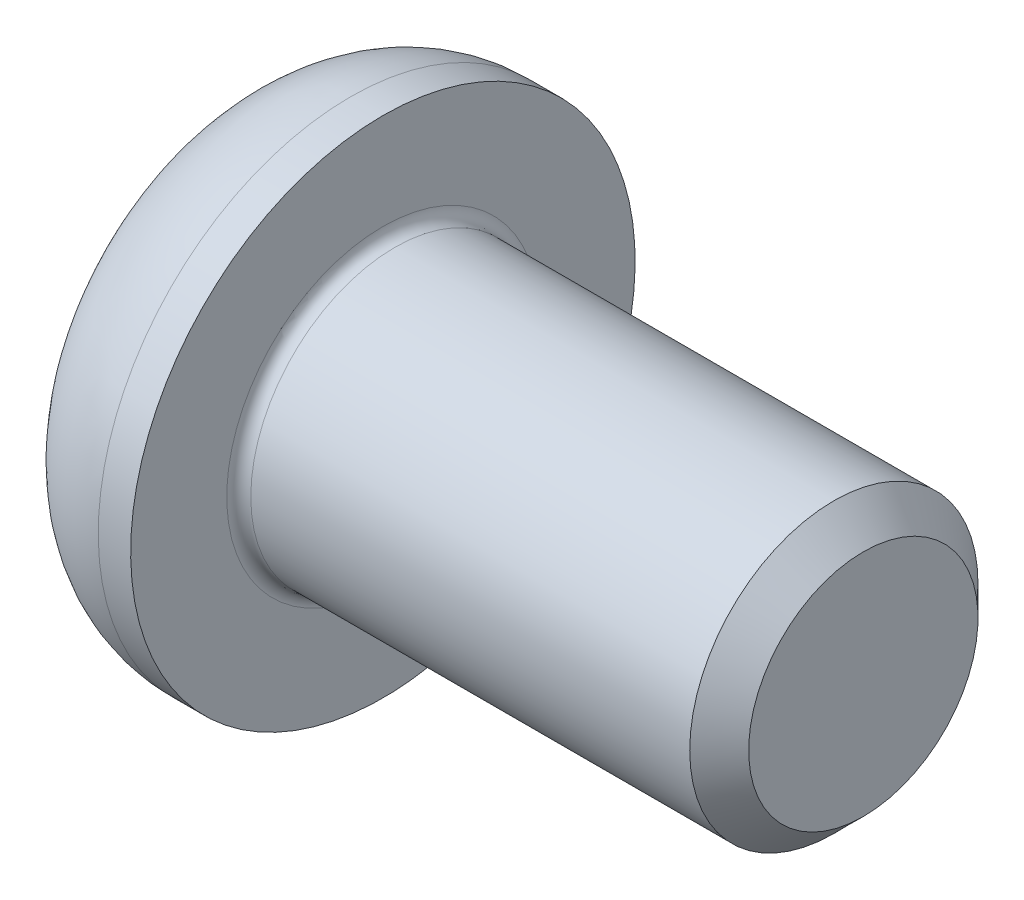
ISO-10303-21;
HEADER;
FILE_DESCRIPTION(('STEP AP214'),'2;1');
FILE_NAME('part.step','',(''),(''),'','','');
FILE_SCHEMA(('AUTOMOTIVE_DESIGN { 1 0 10303 214 1 1 1 1 }'));
ENDSEC;
DATA;
#1=APPLICATION_CONTEXT('core data for automotive mechanical design processes');
#2=APPLICATION_PROTOCOL_DEFINITION('international standard','automotive_design',2000,#1);
#3=PRODUCT_CONTEXT('',#1,'mechanical');
#4=PRODUCT('Part','Part','',(#3));
#5=PRODUCT_RELATED_PRODUCT_CATEGORY('part','',(#4));
#6=PRODUCT_DEFINITION_FORMATION('','',#4);
#7=PRODUCT_DEFINITION_CONTEXT('part definition',#1,'design');
#8=PRODUCT_DEFINITION('design','',#6,#7);
#9=PRODUCT_DEFINITION_SHAPE('','',#8);
#10=(LENGTH_UNIT() NAMED_UNIT(*) SI_UNIT(.MILLI.,.METRE.));
#11=(NAMED_UNIT(*) PLANE_ANGLE_UNIT() SI_UNIT($,.RADIAN.));
#12=(NAMED_UNIT(*) SI_UNIT($,.STERADIAN.) SOLID_ANGLE_UNIT());
#13=UNCERTAINTY_MEASURE_WITH_UNIT(LENGTH_MEASURE(1.E-05),#10,'distance_accuracy_value','');
#14=(GEOMETRIC_REPRESENTATION_CONTEXT(3) GLOBAL_UNCERTAINTY_ASSIGNED_CONTEXT((#13)) GLOBAL_UNIT_ASSIGNED_CONTEXT((#10,
#11,#12)) REPRESENTATION_CONTEXT('',''));
#15=CARTESIAN_POINT('',(0.,0.,0.));
#16=DIRECTION('',(0.,0.,1.));
#17=DIRECTION('',(1.,0.,0.));
#18=AXIS2_PLACEMENT_3D('',#15,#16,#17);
#19=CARTESIAN_POINT('',(0.25,0.,0.));
#20=DIRECTION('',(-1.,0.,0.));
#21=DIRECTION('',(0.,0.707106781186548,0.707106781186548));
#22=AXIS2_PLACEMENT_3D('',#19,#20,#21);
#23=TOROIDAL_SURFACE('',#22,3.25,0.25);
#24=CARTESIAN_POINT('',(0.,0.,0.));
#25=DIRECTION('',(1.,0.,0.));
#26=DIRECTION('',(0.,-1.,0.));
#27=AXIS2_PLACEMENT_3D('',#24,#25,#26);
#28=CIRCLE('',#27,3.25);
#29=CARTESIAN_POINT('',(0.,3.25,0.));
#30=VERTEX_POINT('',#29);
#31=EDGE_CURVE('E11',#30,#30,#28,.T.);
#32=ORIENTED_EDGE('',*,*,#31,.T.);
#33=EDGE_LOOP('',(#32));
#34=FACE_BOUND('',#33,.T.);
#35=CARTESIAN_POINT('',(0.25,0.,0.));
#36=DIRECTION('',(-1.,0.,0.));
#37=DIRECTION('',(0.,-1.,0.));
#38=AXIS2_PLACEMENT_3D('',#35,#36,#37);
#39=CIRCLE('',#38,3.);
#40=CARTESIAN_POINT('',(0.25,3.,0.));
#41=VERTEX_POINT('',#40);
#42=EDGE_CURVE('E29',#41,#41,#39,.T.);
#43=ORIENTED_EDGE('',*,*,#42,.T.);
#44=EDGE_LOOP('',(#43));
#45=FACE_BOUND('',#44,.T.);
#46=ADVANCED_FACE('F17',(#34,#45),#23,.F.);
#47=CARTESIAN_POINT('',(6.,0.,0.));
#48=DIRECTION('',(1.,0.,0.));
#49=DIRECTION('',(0.,1.,0.));
#50=AXIS2_PLACEMENT_3D('',#47,#48,#49);
#51=CYLINDRICAL_SURFACE('',#50,3.);
#52=CARTESIAN_POINT('',(9.38655,0.,0.));
#53=DIRECTION('',(1.,0.,0.));
#54=DIRECTION('',(0.,-1.,0.));
#55=AXIS2_PLACEMENT_3D('',#52,#53,#54);
#56=CIRCLE('',#55,3.);
#57=CARTESIAN_POINT('',(9.38655,3.,0.));
#58=VERTEX_POINT('',#57);
#59=EDGE_CURVE('E241',#58,#58,#56,.T.);
#60=ORIENTED_EDGE('',*,*,#59,.F.);
#61=EDGE_LOOP('',(#60));
#62=FACE_BOUND('',#61,.T.);
#63=ORIENTED_EDGE('',*,*,#42,.F.);
#64=EDGE_LOOP('',(#63));
#65=FACE_BOUND('',#64,.T.);
#66=ADVANCED_FACE('F104',(#62,#65),#51,.T.);
#67=CARTESIAN_POINT('',(0.,4.125,0.));
#68=DIRECTION('',(1.,0.,0.));
#69=DIRECTION('',(0.,0.707106781186548,0.707106781186548));
#70=AXIS2_PLACEMENT_3D('',#67,#68,#69);
#71=PLANE('',#70);
#72=CARTESIAN_POINT('',(0.,0.,0.));
#73=DIRECTION('',(1.,0.,0.));
#74=DIRECTION('',(0.,1.,0.));
#75=AXIS2_PLACEMENT_3D('',#72,#73,#74);
#76=CIRCLE('',#75,5.25);
#77=CARTESIAN_POINT('',(0.,5.25,0.));
#78=VERTEX_POINT('',#77);
#79=EDGE_CURVE('E242',#78,#78,#76,.T.);
#80=ORIENTED_EDGE('',*,*,#79,.T.);
#81=EDGE_LOOP('',(#80));
#82=FACE_BOUND('',#81,.T.);
#83=ORIENTED_EDGE('',*,*,#31,.F.);
#84=EDGE_LOOP('',(#83));
#85=FACE_BOUND('',#84,.T.);
#86=ADVANCED_FACE('F110',(#82,#85),#71,.T.);
#87=CARTESIAN_POINT('',(9.693275,0.,0.));
#88=DIRECTION('',(-1.,0.,0.));
#89=DIRECTION('',(0.,-1.,0.));
#90=AXIS2_PLACEMENT_3D('',#87,#88,#89);
#91=CONICAL_SURFACE('',#90,2.693275,0.785398163397448);
#92=ORIENTED_EDGE('',*,*,#59,.T.);
#93=EDGE_LOOP('',(#92));
#94=FACE_BOUND('',#93,.T.);
#95=CARTESIAN_POINT('',(10.,0.,0.));
#96=DIRECTION('',(-1.,0.,0.));
#97=DIRECTION('',(0.,-1.,0.));
#98=AXIS2_PLACEMENT_3D('',#95,#96,#97);
#99=CIRCLE('',#98,2.38655);
#100=CARTESIAN_POINT('',(10.,2.38655,0.));
#101=VERTEX_POINT('',#100);
#102=EDGE_CURVE('E238',#101,#101,#99,.T.);
#103=ORIENTED_EDGE('',*,*,#102,.T.);
#104=EDGE_LOOP('',(#103));
#105=FACE_BOUND('',#104,.T.);
#106=ADVANCED_FACE('F117',(#94,#105),#91,.T.);
#107=CARTESIAN_POINT('',(10.,1.5,0.));
#108=DIRECTION('',(1.,0.,0.));
#109=DIRECTION('',(0.,0.707106781186548,0.707106781186548));
#110=AXIS2_PLACEMENT_3D('',#107,#108,#109);
#111=PLANE('',#110);
#112=ORIENTED_EDGE('',*,*,#102,.F.);
#113=EDGE_LOOP('',(#112));
#114=FACE_BOUND('',#113,.T.);
#115=ADVANCED_FACE('F121',(#114),#111,.T.);
#116=CARTESIAN_POINT('',(-0.675,0.,0.));
#117=DIRECTION('',(1.,0.,0.));
#118=DIRECTION('',(0.,0.707106781186548,0.707106781186548));
#119=AXIS2_PLACEMENT_3D('',#116,#117,#118);
#120=DEGENERATE_TOROIDAL_SURFACE('',#119,2.625,2.625,.T.);
#121=CARTESIAN_POINT('',(-3.3,0.,0.));
#122=DIRECTION('',(1.,0.,0.));
#123=DIRECTION('',(0.,-1.,0.));
#124=AXIS2_PLACEMENT_3D('',#121,#122,#123);
#125=CIRCLE('',#124,2.625);
#126=CARTESIAN_POINT('',(-3.3,2.625,0.));
#127=VERTEX_POINT('',#126);
#128=EDGE_CURVE('E235',#127,#127,#125,.T.);
#129=ORIENTED_EDGE('',*,*,#128,.T.);
#130=EDGE_LOOP('',(#129));
#131=FACE_BOUND('',#130,.T.);
#132=CARTESIAN_POINT('',(-0.675,0.,0.));
#133=DIRECTION('',(-1.,0.,0.));
#134=DIRECTION('',(0.,-1.,0.));
#135=AXIS2_PLACEMENT_3D('',#132,#133,#134);
#136=CIRCLE('',#135,5.25);
#137=CARTESIAN_POINT('',(-0.675,5.25,0.));
#138=VERTEX_POINT('',#137);
#139=EDGE_CURVE('E232',#138,#138,#136,.T.);
#140=ORIENTED_EDGE('',*,*,#139,.T.);
#141=EDGE_LOOP('',(#140));
#142=FACE_BOUND('',#141,.T.);
#143=ADVANCED_FACE('F125',(#131,#142),#120,.T.);
#144=CARTESIAN_POINT('',(-3.3,3.77970053837925,0.));
#145=DIRECTION('',(-1.,0.,0.));
#146=DIRECTION('',(0.,0.707106781186548,0.707106781186548));
#147=AXIS2_PLACEMENT_3D('',#144,#145,#146);
#148=PLANE('',#147);
#149=DIRECTION('',(0.,0.,1.));
#150=VECTOR('',#149,1.);
#151=CARTESIAN_POINT('',(-3.3,2.,0.577350269189624));
#152=LINE('',#151,#150);
#153=CARTESIAN_POINT('',(-3.3,2.,-1.15470053837925));
#154=VERTEX_POINT('',#153);
#155=CARTESIAN_POINT('',(-3.3,2.,1.15470053837925));
#156=VERTEX_POINT('',#155);
#157=EDGE_CURVE('E229',#154,#156,#152,.T.);
#158=ORIENTED_EDGE('',*,*,#157,.T.);
#159=DIRECTION('',(0.,-0.866025403784438,0.5));
#160=VECTOR('',#159,1.);
#161=CARTESIAN_POINT('',(-3.3,0.5,2.02072594216369));
#162=LINE('',#161,#160);
#163=CARTESIAN_POINT('',(-3.3,0.,2.30940107675851));
#164=VERTEX_POINT('',#163);
#165=EDGE_CURVE('E226',#156,#164,#162,.T.);
#166=ORIENTED_EDGE('',*,*,#165,.T.);
#167=DIRECTION('',(0.,-0.866025403784439,-0.5));
#168=VECTOR('',#167,1.);
#169=CARTESIAN_POINT('',(-3.3,-1.5,1.44337567297406));
#170=LINE('',#169,#168);
#171=CARTESIAN_POINT('',(-3.3,-2.,1.15470053837925));
#172=VERTEX_POINT('',#171);
#173=EDGE_CURVE('E223',#164,#172,#170,.T.);
#174=ORIENTED_EDGE('',*,*,#173,.T.);
#175=DIRECTION('',(0.,0.,-1.));
#176=VECTOR('',#175,1.);
#177=CARTESIAN_POINT('',(-3.3,-2.,-0.577350269189625));
#178=LINE('',#177,#176);
#179=CARTESIAN_POINT('',(-3.3,-2.,-1.15470053837925));
#180=VERTEX_POINT('',#179);
#181=EDGE_CURVE('E220',#172,#180,#178,.T.);
#182=ORIENTED_EDGE('',*,*,#181,.T.);
#183=DIRECTION('',(0.,0.866025403784439,-0.5));
#184=VECTOR('',#183,1.);
#185=CARTESIAN_POINT('',(-3.3,-0.5,-2.02072594216369));
#186=LINE('',#185,#184);
#187=CARTESIAN_POINT('',(-3.3,0.,-2.30940107675851));
#188=VERTEX_POINT('',#187);
#189=EDGE_CURVE('E217',#180,#188,#186,.T.);
#190=ORIENTED_EDGE('',*,*,#189,.T.);
#191=DIRECTION('',(0.,0.866025403784439,0.5));
#192=VECTOR('',#191,1.);
#193=CARTESIAN_POINT('',(-3.3,1.5,-1.44337567297406));
#194=LINE('',#193,#192);
#195=EDGE_CURVE('E209',#188,#154,#194,.T.);
#196=ORIENTED_EDGE('',*,*,#195,.T.);
#197=EDGE_LOOP('',(#158,#166,#174,#182,#190,#196));
#198=FACE_BOUND('',#197,.T.);
#199=ORIENTED_EDGE('',*,*,#128,.F.);
#200=EDGE_LOOP('',(#199));
#201=FACE_BOUND('',#200,.T.);
#202=ADVANCED_FACE('F129',(#198,#201),#148,.T.);
#203=CARTESIAN_POINT('',(-1.65,0.,0.));
#204=DIRECTION('',(1.,0.,0.));
#205=DIRECTION('',(0.,1.,0.));
#206=AXIS2_PLACEMENT_3D('',#203,#204,#205);
#207=CYLINDRICAL_SURFACE('',#206,5.25);
#208=ORIENTED_EDGE('',*,*,#79,.F.);
#209=EDGE_LOOP('',(#208));
#210=FACE_BOUND('',#209,.T.);
#211=ORIENTED_EDGE('',*,*,#139,.F.);
#212=EDGE_LOOP('',(#211));
#213=FACE_BOUND('',#212,.T.);
#214=ADVANCED_FACE('F133',(#210,#213),#207,.T.);
#215=CARTESIAN_POINT('',(-3.3,0.,-2.30940107675851));
#216=DIRECTION('',(0.,-0.5,-0.866025403784439));
#217=DIRECTION('',(0.447213595499958,-0.774596669241483,0.447213595499958));
#218=AXIS2_PLACEMENT_3D('',#215,#216,#217);
#219=PLANE('',#218);
#220=CARTESIAN_POINT('',(-1.22,0.,-2.3094010767585));
#221=CARTESIAN_POINT('',(-0.886666666666666,-1.,-1.73205080756888));
#222=CARTESIAN_POINT('',(-1.22,-2.,-1.15470053837925));
#223=(BOUNDED_CURVE() B_SPLINE_CURVE(2,(#220,#221,#222),.UNSPECIFIED.,.F.,
.F.) B_SPLINE_CURVE_WITH_KNOTS((3,3),(0.,0.233687227615582),
.UNSPECIFIED.) CURVE() GEOMETRIC_REPRESENTATION_ITEM() RATIONAL_B_SPLINE_CURVE((1.,
1.15470053837925,1.)) REPRESENTATION_ITEM(''));
#224=CARTESIAN_POINT('',(-1.22,0.,-2.30940107675851));
#225=VERTEX_POINT('',#224);
#226=CARTESIAN_POINT('',(-1.22,-2.,-1.15470053837925));
#227=VERTEX_POINT('',#226);
#228=EDGE_CURVE('E164',#225,#227,#223,.T.);
#229=ORIENTED_EDGE('',*,*,#228,.F.);
#230=DIRECTION('',(-1.,0.,0.));
#231=VECTOR('',#230,1.);
#232=CARTESIAN_POINT('',(-2.26,0.,-2.30940107675851));
#233=LINE('',#232,#231);
#234=EDGE_CURVE('E200',#225,#188,#233,.T.);
#235=ORIENTED_EDGE('',*,*,#234,.T.);
#236=ORIENTED_EDGE('',*,*,#189,.F.);
#237=DIRECTION('',(-1.,0.,0.));
#238=VECTOR('',#237,1.);
#239=CARTESIAN_POINT('',(-2.26,-2.,-1.15470053837925));
#240=LINE('',#239,#238);
#241=EDGE_CURVE('E160',#227,#180,#240,.T.);
#242=ORIENTED_EDGE('',*,*,#241,.F.);
#243=EDGE_LOOP('',(#229,#235,#236,#242));
#244=FACE_BOUND('',#243,.T.);
#245=ADVANCED_FACE('F137',(#244),#219,.F.);
#246=CARTESIAN_POINT('',(-3.3,2.,-1.15470053837925));
#247=DIRECTION('',(0.,0.5,-0.866025403784439));
#248=DIRECTION('',(0.654653670707977,0.654653670707977,0.377964473009227));
#249=AXIS2_PLACEMENT_3D('',#246,#247,#248);
#250=PLANE('',#249);
#251=CARTESIAN_POINT('',(-1.22,2.,-1.15470053837926));
#252=CARTESIAN_POINT('',(-0.886666666666666,0.999999999999998,-1.73205080756888));
#253=CARTESIAN_POINT('',(-1.22,0.,-2.3094010767585));
#254=(BOUNDED_CURVE() B_SPLINE_CURVE(2,(#251,#252,#253),.UNSPECIFIED.,.F.,
.F.) B_SPLINE_CURVE_WITH_KNOTS((3,3),(0.,0.233687227615582),
.UNSPECIFIED.) CURVE() GEOMETRIC_REPRESENTATION_ITEM() RATIONAL_B_SPLINE_CURVE((1.,
1.15470053837925,1.)) REPRESENTATION_ITEM(''));
#255=CARTESIAN_POINT('',(-1.22,2.,-1.15470053837925));
#256=VERTEX_POINT('',#255);
#257=EDGE_CURVE('E166',#256,#225,#254,.T.);
#258=ORIENTED_EDGE('',*,*,#257,.F.);
#259=DIRECTION('',(-1.,0.,0.));
#260=VECTOR('',#259,1.);
#261=CARTESIAN_POINT('',(-2.26,2.,-1.15470053837925));
#262=LINE('',#261,#260);
#263=EDGE_CURVE('E191',#256,#154,#262,.T.);
#264=ORIENTED_EDGE('',*,*,#263,.T.);
#265=ORIENTED_EDGE('',*,*,#195,.F.);
#266=ORIENTED_EDGE('',*,*,#234,.F.);
#267=EDGE_LOOP('',(#258,#264,#265,#266));
#268=FACE_BOUND('',#267,.T.);
#269=ADVANCED_FACE('F141',(#268),#250,.F.);
#270=CARTESIAN_POINT('',(-3.3,2.,1.15470053837925));
#271=DIRECTION('',(0.,1.,0.));
#272=DIRECTION('',(0.707106781186548,0.,0.707106781186548));
#273=AXIS2_PLACEMENT_3D('',#270,#271,#272);
#274=PLANE('',#273);
#275=CARTESIAN_POINT('',(-1.22,2.,1.15470053837924));
#276=CARTESIAN_POINT('',(-0.886666666666666,2.,0.));
#277=CARTESIAN_POINT('',(-1.22,2.,-1.15470053837924));
#278=(BOUNDED_CURVE() B_SPLINE_CURVE(2,(#275,#276,#277),.UNSPECIFIED.,.F.,
.F.) B_SPLINE_CURVE_WITH_KNOTS((3,3),(0.,0.233687227615582),
.UNSPECIFIED.) CURVE() GEOMETRIC_REPRESENTATION_ITEM() RATIONAL_B_SPLINE_CURVE((1.,
1.15470053837925,1.)) REPRESENTATION_ITEM(''));
#279=CARTESIAN_POINT('',(-1.22,2.,1.15470053837925));
#280=VERTEX_POINT('',#279);
#281=EDGE_CURVE('E181',#280,#256,#278,.T.);
#282=ORIENTED_EDGE('',*,*,#281,.F.);
#283=DIRECTION('',(-1.,0.,0.));
#284=VECTOR('',#283,1.);
#285=CARTESIAN_POINT('',(-2.26,2.,1.15470053837925));
#286=LINE('',#285,#284);
#287=EDGE_CURVE('E176',#280,#156,#286,.T.);
#288=ORIENTED_EDGE('',*,*,#287,.T.);
#289=ORIENTED_EDGE('',*,*,#157,.F.);
#290=ORIENTED_EDGE('',*,*,#263,.F.);
#291=EDGE_LOOP('',(#282,#288,#289,#290));
#292=FACE_BOUND('',#291,.T.);
#293=ADVANCED_FACE('F145',(#292),#274,.F.);
#294=CARTESIAN_POINT('',(-3.3,0.,2.30940107675851));
#295=DIRECTION('',(0.,0.5,0.866025403784438));
#296=DIRECTION('',(0.447213595499959,-0.774596669241483,0.447213595499959));
#297=AXIS2_PLACEMENT_3D('',#294,#295,#296);
#298=PLANE('',#297);
#299=CARTESIAN_POINT('',(-1.22,0.,2.3094010767585));
#300=CARTESIAN_POINT('',(-0.886666666666664,1.,1.73205080756888));
#301=CARTESIAN_POINT('',(-1.22,2.,1.15470053837925));
#302=(BOUNDED_CURVE() B_SPLINE_CURVE(2,(#299,#300,#301),.UNSPECIFIED.,.F.,
.F.) B_SPLINE_CURVE_WITH_KNOTS((3,3),(0.,0.233687227615582),
.UNSPECIFIED.) CURVE() GEOMETRIC_REPRESENTATION_ITEM() RATIONAL_B_SPLINE_CURVE((1.,
1.15470053837925,1.)) REPRESENTATION_ITEM(''));
#303=CARTESIAN_POINT('',(-1.22,0.,2.30940107675851));
#304=VERTEX_POINT('',#303);
#305=EDGE_CURVE('E179',#304,#280,#302,.T.);
#306=ORIENTED_EDGE('',*,*,#305,.F.);
#307=DIRECTION('',(1.,0.,0.));
#308=VECTOR('',#307,1.);
#309=CARTESIAN_POINT('',(-2.26,0.,2.30940107675851));
#310=LINE('',#309,#308);
#311=EDGE_CURVE('E171',#164,#304,#310,.T.);
#312=ORIENTED_EDGE('',*,*,#311,.F.);
#313=ORIENTED_EDGE('',*,*,#165,.F.);
#314=ORIENTED_EDGE('',*,*,#287,.F.);
#315=EDGE_LOOP('',(#306,#312,#313,#314));
#316=FACE_BOUND('',#315,.T.);
#317=ADVANCED_FACE('F149',(#316),#298,.F.);
#318=CARTESIAN_POINT('',(-3.3,-2.,-1.15470053837925));
#319=DIRECTION('',(0.,-1.,0.));
#320=DIRECTION('',(0.707106781186548,0.,0.707106781186548));
#321=AXIS2_PLACEMENT_3D('',#318,#319,#320);
#322=PLANE('',#321);
#323=CARTESIAN_POINT('',(-1.22,-2.,-1.15470053837924));
#324=CARTESIAN_POINT('',(-0.886666666666666,-2.,0.));
#325=CARTESIAN_POINT('',(-1.22,-2.,1.15470053837925));
#326=(BOUNDED_CURVE() B_SPLINE_CURVE(2,(#323,#324,#325),.UNSPECIFIED.,.F.,
.F.) B_SPLINE_CURVE_WITH_KNOTS((3,3),(0.,0.233687227615582),
.UNSPECIFIED.) CURVE() GEOMETRIC_REPRESENTATION_ITEM() RATIONAL_B_SPLINE_CURVE((1.,
1.15470053837925,1.)) REPRESENTATION_ITEM(''));
#327=CARTESIAN_POINT('',(-1.22,-2.,1.15470053837925));
#328=VERTEX_POINT('',#327);
#329=EDGE_CURVE('E90',#227,#328,#326,.T.);
#330=ORIENTED_EDGE('',*,*,#329,.F.);
#331=ORIENTED_EDGE('',*,*,#241,.T.);
#332=ORIENTED_EDGE('',*,*,#181,.F.);
#333=DIRECTION('',(-1.,0.,0.));
#334=VECTOR('',#333,1.);
#335=CARTESIAN_POINT('',(-2.26,-2.,1.15470053837925));
#336=LINE('',#335,#334);
#337=EDGE_CURVE('E162',#328,#172,#336,.T.);
#338=ORIENTED_EDGE('',*,*,#337,.F.);
#339=EDGE_LOOP('',(#330,#331,#332,#338));
#340=FACE_BOUND('',#339,.T.);
#341=ADVANCED_FACE('F100',(#340),#322,.F.);
#342=CARTESIAN_POINT('',(-3.3,-2.,1.15470053837925));
#343=DIRECTION('',(0.,-0.5,0.866025403784439));
#344=DIRECTION('',(0.654653670707977,0.654653670707977,0.377964473009227));
#345=AXIS2_PLACEMENT_3D('',#342,#343,#344);
#346=PLANE('',#345);
#347=CARTESIAN_POINT('',(-1.22,-2.,1.15470053837926));
#348=CARTESIAN_POINT('',(-0.886666666666666,-1.,1.73205080756888));
#349=CARTESIAN_POINT('',(-1.22,0.,2.3094010767585));
#350=(BOUNDED_CURVE() B_SPLINE_CURVE(2,(#347,#348,#349),.UNSPECIFIED.,.F.,
.F.) B_SPLINE_CURVE_WITH_KNOTS((3,3),(0.,0.233687227615582),
.UNSPECIFIED.) CURVE() GEOMETRIC_REPRESENTATION_ITEM() RATIONAL_B_SPLINE_CURVE((1.,
1.15470053837925,1.)) REPRESENTATION_ITEM(''));
#351=EDGE_CURVE('E21',#328,#304,#350,.T.);
#352=ORIENTED_EDGE('',*,*,#351,.F.);
#353=ORIENTED_EDGE('',*,*,#337,.T.);
#354=ORIENTED_EDGE('',*,*,#173,.F.);
#355=ORIENTED_EDGE('',*,*,#311,.T.);
#356=EDGE_LOOP('',(#352,#353,#354,#355));
#357=FACE_BOUND('',#356,.T.);
#358=ADVANCED_FACE('F95',(#357),#346,.F.);
#359=CARTESIAN_POINT('',(-0.55333333333333,0.,0.));
#360=DIRECTION('',(-1.,0.,0.));
#361=DIRECTION('',(0.,1.,0.));
#362=AXIS2_PLACEMENT_3D('',#359,#360,#361);
#363=CONICAL_SURFACE('',#362,1.15470053837925,1.0471975511966);
#364=ORIENTED_EDGE('',*,*,#305,.T.);
#365=ORIENTED_EDGE('',*,*,#281,.T.);
#366=ORIENTED_EDGE('',*,*,#257,.T.);
#367=ORIENTED_EDGE('',*,*,#228,.T.);
#368=ORIENTED_EDGE('',*,*,#329,.T.);
#369=ORIENTED_EDGE('',*,*,#351,.T.);
#370=EDGE_LOOP('',(#364,#365,#366,#367,#368,#369));
#371=FACE_BOUND('',#370,.T.);
#372=CARTESIAN_POINT('',(0.113333333333338,0.,0.));
#373=VERTEX_POINT('',#372);
#374=VERTEX_LOOP('',#373);
#375=FACE_BOUND('',#374,.T.);
#376=ADVANCED_FACE('F19',(#371,#375),#363,.F.);
#377=CLOSED_SHELL('',(#46,#66,#86,#106,#115,#143,#202,#214,#245,#269,#293,#317,#341,#358,#376));
#378=MANIFOLD_SOLID_BREP('B1',#377);
#379=ADVANCED_BREP_SHAPE_REPRESENTATION('',(#18,#378),#14);
#380=SHAPE_DEFINITION_REPRESENTATION(#9,#379);
ENDSEC;
END-ISO-10303-21;
